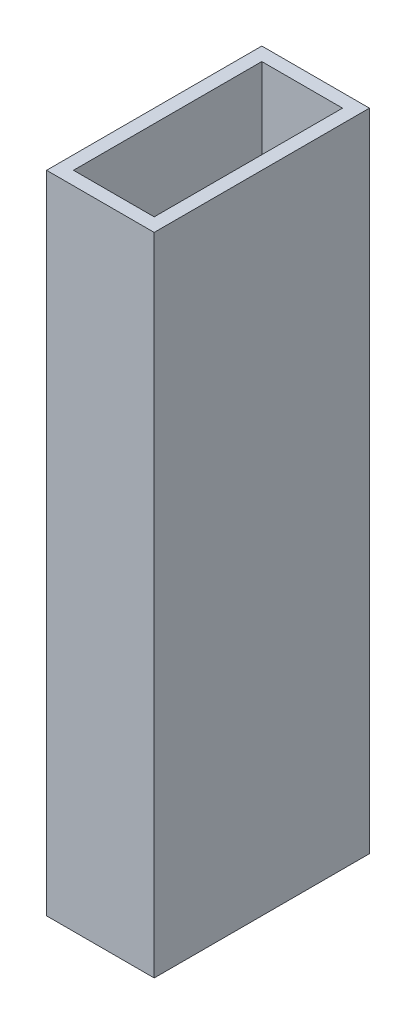
ISO-10303-21;
HEADER;
FILE_DESCRIPTION(('STEP AP214'),'2;1');
FILE_NAME('part.step','',(''),(''),'','','');
FILE_SCHEMA(('AUTOMOTIVE_DESIGN { 1 0 10303 214 1 1 1 1 }'));
ENDSEC;
DATA;
#1=APPLICATION_CONTEXT('core data for automotive mechanical design processes');
#2=APPLICATION_PROTOCOL_DEFINITION('international standard','automotive_design',2000,#1);
#3=PRODUCT_CONTEXT('',#1,'mechanical');
#4=PRODUCT('Part','Part','',(#3));
#5=PRODUCT_RELATED_PRODUCT_CATEGORY('part','',(#4));
#6=PRODUCT_DEFINITION_FORMATION('','',#4);
#7=PRODUCT_DEFINITION_CONTEXT('part definition',#1,'design');
#8=PRODUCT_DEFINITION('design','',#6,#7);
#9=PRODUCT_DEFINITION_SHAPE('','',#8);
#10=(LENGTH_UNIT() NAMED_UNIT(*) SI_UNIT(.MILLI.,.METRE.));
#11=(NAMED_UNIT(*) PLANE_ANGLE_UNIT() SI_UNIT($,.RADIAN.));
#12=(NAMED_UNIT(*) SI_UNIT($,.STERADIAN.) SOLID_ANGLE_UNIT());
#13=UNCERTAINTY_MEASURE_WITH_UNIT(LENGTH_MEASURE(1.E-05),#10,'distance_accuracy_value','');
#14=(GEOMETRIC_REPRESENTATION_CONTEXT(3) GLOBAL_UNCERTAINTY_ASSIGNED_CONTEXT((#13)) GLOBAL_UNIT_ASSIGNED_CONTEXT((#10,
#11,#12)) REPRESENTATION_CONTEXT('',''));
#15=CARTESIAN_POINT('',(0.,0.,0.));
#16=DIRECTION('',(0.,0.,1.));
#17=DIRECTION('',(1.,0.,0.));
#18=AXIS2_PLACEMENT_3D('',#15,#16,#17);
#19=CARTESIAN_POINT('',(0.,152.4,0.));
#20=DIRECTION('',(0.,-1.,0.));
#21=DIRECTION('',(0.,0.,-1.));
#22=AXIS2_PLACEMENT_3D('',#19,#20,#21);
#23=PLANE('',#22);
#24=DIRECTION('',(0.,0.,-1.));
#25=VECTOR('',#24,1.);
#26=CARTESIAN_POINT('',(12.7,152.4,25.4));
#27=LINE('',#26,#25);
#28=CARTESIAN_POINT('',(12.7,152.4,25.4));
#29=VERTEX_POINT('',#28);
#30=CARTESIAN_POINT('',(12.7,152.4,-25.4));
#31=VERTEX_POINT('',#30);
#32=EDGE_CURVE('E159',#29,#31,#27,.T.);
#33=ORIENTED_EDGE('',*,*,#32,.T.);
#34=DIRECTION('',(-1.,0.,0.));
#35=VECTOR('',#34,1.);
#36=CARTESIAN_POINT('',(-12.7,152.4,-25.4));
#37=LINE('',#36,#35);
#38=CARTESIAN_POINT('',(-12.7,152.4,-25.4));
#39=VERTEX_POINT('',#38);
#40=EDGE_CURVE('E163',#31,#39,#37,.T.);
#41=ORIENTED_EDGE('',*,*,#40,.T.);
#42=DIRECTION('',(0.,0.,1.));
#43=VECTOR('',#42,1.);
#44=CARTESIAN_POINT('',(-12.7,152.4,25.4));
#45=LINE('',#44,#43);
#46=CARTESIAN_POINT('',(-12.7,152.4,25.4));
#47=VERTEX_POINT('',#46);
#48=EDGE_CURVE('E167',#39,#47,#45,.T.);
#49=ORIENTED_EDGE('',*,*,#48,.T.);
#50=DIRECTION('',(1.,0.,0.));
#51=VECTOR('',#50,1.);
#52=CARTESIAN_POINT('',(-12.7,152.4,25.4));
#53=LINE('',#52,#51);
#54=EDGE_CURVE('E170',#47,#29,#53,.T.);
#55=ORIENTED_EDGE('',*,*,#54,.T.);
#56=EDGE_LOOP('',(#33,#41,#49,#55));
#57=FACE_BOUND('',#56,.T.);
#58=DIRECTION('',(1.,0.,0.));
#59=VECTOR('',#58,1.);
#60=CARTESIAN_POINT('',(-9.525,152.4,22.225));
#61=LINE('',#60,#59);
#62=CARTESIAN_POINT('',(-9.525,152.4,22.225));
#63=VERTEX_POINT('',#62);
#64=CARTESIAN_POINT('',(9.525,152.4,22.225));
#65=VERTEX_POINT('',#64);
#66=EDGE_CURVE('E111',#63,#65,#61,.T.);
#67=ORIENTED_EDGE('',*,*,#66,.F.);
#68=DIRECTION('',(0.,0.,1.));
#69=VECTOR('',#68,1.);
#70=CARTESIAN_POINT('',(-9.525,152.4,22.225));
#71=LINE('',#70,#69);
#72=CARTESIAN_POINT('',(-9.525,152.4,-22.225));
#73=VERTEX_POINT('',#72);
#74=EDGE_CURVE('E137',#73,#63,#71,.T.);
#75=ORIENTED_EDGE('',*,*,#74,.F.);
#76=DIRECTION('',(-1.,0.,0.));
#77=VECTOR('',#76,1.);
#78=CARTESIAN_POINT('',(-9.525,152.4,-22.225));
#79=LINE('',#78,#77);
#80=CARTESIAN_POINT('',(9.525,152.4,-22.225));
#81=VERTEX_POINT('',#80);
#82=EDGE_CURVE('E133',#81,#73,#79,.T.);
#83=ORIENTED_EDGE('',*,*,#82,.F.);
#84=DIRECTION('',(0.,0.,-1.));
#85=VECTOR('',#84,1.);
#86=CARTESIAN_POINT('',(9.525,152.4,22.225));
#87=LINE('',#86,#85);
#88=EDGE_CURVE('E120',#65,#81,#87,.T.);
#89=ORIENTED_EDGE('',*,*,#88,.F.);
#90=EDGE_LOOP('',(#67,#75,#83,#89));
#91=FACE_BOUND('',#90,.T.);
#92=ADVANCED_FACE('F45',(#57,#91),#23,.F.);
#93=CARTESIAN_POINT('',(0.,0.,0.));
#94=DIRECTION('',(0.,-1.,0.));
#95=DIRECTION('',(0.,0.,-1.));
#96=AXIS2_PLACEMENT_3D('',#93,#94,#95);
#97=PLANE('',#96);
#98=DIRECTION('',(0.,0.,-1.));
#99=VECTOR('',#98,1.);
#100=CARTESIAN_POINT('',(12.7,0.,25.4));
#101=LINE('',#100,#99);
#102=CARTESIAN_POINT('',(12.7,0.,25.4));
#103=VERTEX_POINT('',#102);
#104=CARTESIAN_POINT('',(12.7,0.,-25.4));
#105=VERTEX_POINT('',#104);
#106=EDGE_CURVE('E129',#103,#105,#101,.T.);
#107=ORIENTED_EDGE('',*,*,#106,.F.);
#108=DIRECTION('',(1.,0.,0.));
#109=VECTOR('',#108,1.);
#110=CARTESIAN_POINT('',(-12.7,0.,25.4));
#111=LINE('',#110,#109);
#112=CARTESIAN_POINT('',(-12.7,0.,25.4));
#113=VERTEX_POINT('',#112);
#114=EDGE_CURVE('E164',#113,#103,#111,.T.);
#115=ORIENTED_EDGE('',*,*,#114,.F.);
#116=DIRECTION('',(0.,0.,1.));
#117=VECTOR('',#116,1.);
#118=CARTESIAN_POINT('',(-12.7,0.,25.4));
#119=LINE('',#118,#117);
#120=CARTESIAN_POINT('',(-12.7,0.,-25.4));
#121=VERTEX_POINT('',#120);
#122=EDGE_CURVE('E180',#121,#113,#119,.T.);
#123=ORIENTED_EDGE('',*,*,#122,.F.);
#124=DIRECTION('',(-1.,0.,0.));
#125=VECTOR('',#124,1.);
#126=CARTESIAN_POINT('',(-12.7,0.,-25.4));
#127=LINE('',#126,#125);
#128=EDGE_CURVE('E177',#105,#121,#127,.T.);
#129=ORIENTED_EDGE('',*,*,#128,.F.);
#130=EDGE_LOOP('',(#107,#115,#123,#129));
#131=FACE_BOUND('',#130,.T.);
#132=DIRECTION('',(0.,0.,1.));
#133=VECTOR('',#132,1.);
#134=CARTESIAN_POINT('',(-9.525,0.,22.225));
#135=LINE('',#134,#133);
#136=CARTESIAN_POINT('',(-9.525,0.,-22.225));
#137=VERTEX_POINT('',#136);
#138=CARTESIAN_POINT('',(-9.525,0.,22.225));
#139=VERTEX_POINT('',#138);
#140=EDGE_CURVE('E121',#137,#139,#135,.T.);
#141=ORIENTED_EDGE('',*,*,#140,.T.);
#142=DIRECTION('',(1.,0.,0.));
#143=VECTOR('',#142,1.);
#144=CARTESIAN_POINT('',(-9.525,0.,22.225));
#145=LINE('',#144,#143);
#146=CARTESIAN_POINT('',(9.525,0.,22.225));
#147=VERTEX_POINT('',#146);
#148=EDGE_CURVE('E69',#139,#147,#145,.T.);
#149=ORIENTED_EDGE('',*,*,#148,.T.);
#150=DIRECTION('',(0.,0.,-1.));
#151=VECTOR('',#150,1.);
#152=CARTESIAN_POINT('',(9.525,0.,22.225));
#153=LINE('',#152,#151);
#154=CARTESIAN_POINT('',(9.525,0.,-22.225));
#155=VERTEX_POINT('',#154);
#156=EDGE_CURVE('E127',#147,#155,#153,.T.);
#157=ORIENTED_EDGE('',*,*,#156,.T.);
#158=DIRECTION('',(-1.,0.,0.));
#159=VECTOR('',#158,1.);
#160=CARTESIAN_POINT('',(-9.525,0.,-22.225));
#161=LINE('',#160,#159);
#162=EDGE_CURVE('E146',#155,#137,#161,.T.);
#163=ORIENTED_EDGE('',*,*,#162,.T.);
#164=EDGE_LOOP('',(#141,#149,#157,#163));
#165=FACE_BOUND('',#164,.T.);
#166=ADVANCED_FACE('F203',(#131,#165),#97,.T.);
#167=CARTESIAN_POINT('',(12.7,152.4,25.4));
#168=DIRECTION('',(-1.,0.,0.));
#169=DIRECTION('',(0.,0.,1.));
#170=AXIS2_PLACEMENT_3D('',#167,#168,#169);
#171=PLANE('',#170);
#172=ORIENTED_EDGE('',*,*,#106,.T.);
#173=DIRECTION('',(0.,-1.,0.));
#174=VECTOR('',#173,1.);
#175=CARTESIAN_POINT('',(12.7,152.4,-25.4));
#176=LINE('',#175,#174);
#177=EDGE_CURVE('E11',#31,#105,#176,.T.);
#178=ORIENTED_EDGE('',*,*,#177,.F.);
#179=ORIENTED_EDGE('',*,*,#32,.F.);
#180=DIRECTION('',(0.,-1.,0.));
#181=VECTOR('',#180,1.);
#182=CARTESIAN_POINT('',(12.7,152.4,25.4));
#183=LINE('',#182,#181);
#184=EDGE_CURVE('E173',#29,#103,#183,.T.);
#185=ORIENTED_EDGE('',*,*,#184,.T.);
#186=EDGE_LOOP('',(#172,#178,#179,#185));
#187=FACE_BOUND('',#186,.T.);
#188=ADVANCED_FACE('F47',(#187),#171,.F.);
#189=CARTESIAN_POINT('',(-12.7,152.4,-25.4));
#190=DIRECTION('',(0.,0.,1.));
#191=DIRECTION('',(1.,0.,0.));
#192=AXIS2_PLACEMENT_3D('',#189,#190,#191);
#193=PLANE('',#192);
#194=ORIENTED_EDGE('',*,*,#128,.T.);
#195=DIRECTION('',(0.,-1.,0.));
#196=VECTOR('',#195,1.);
#197=CARTESIAN_POINT('',(-12.7,152.4,-25.4));
#198=LINE('',#197,#196);
#199=EDGE_CURVE('E54',#39,#121,#198,.T.);
#200=ORIENTED_EDGE('',*,*,#199,.F.);
#201=ORIENTED_EDGE('',*,*,#40,.F.);
#202=ORIENTED_EDGE('',*,*,#177,.T.);
#203=EDGE_LOOP('',(#194,#200,#201,#202));
#204=FACE_BOUND('',#203,.T.);
#205=ADVANCED_FACE('F213',(#204),#193,.F.);
#206=CARTESIAN_POINT('',(-12.7,152.4,25.4));
#207=DIRECTION('',(1.,0.,0.));
#208=DIRECTION('',(0.,0.,-1.));
#209=AXIS2_PLACEMENT_3D('',#206,#207,#208);
#210=PLANE('',#209);
#211=ORIENTED_EDGE('',*,*,#122,.T.);
#212=DIRECTION('',(0.,-1.,0.));
#213=VECTOR('',#212,1.);
#214=CARTESIAN_POINT('',(-12.7,152.4,25.4));
#215=LINE('',#214,#213);
#216=EDGE_CURVE('E188',#47,#113,#215,.T.);
#217=ORIENTED_EDGE('',*,*,#216,.F.);
#218=ORIENTED_EDGE('',*,*,#48,.F.);
#219=ORIENTED_EDGE('',*,*,#199,.T.);
#220=EDGE_LOOP('',(#211,#217,#218,#219));
#221=FACE_BOUND('',#220,.T.);
#222=ADVANCED_FACE('F197',(#221),#210,.F.);
#223=CARTESIAN_POINT('',(-12.7,152.4,25.4));
#224=DIRECTION('',(0.,0.,-1.));
#225=DIRECTION('',(-1.,0.,0.));
#226=AXIS2_PLACEMENT_3D('',#223,#224,#225);
#227=PLANE('',#226);
#228=ORIENTED_EDGE('',*,*,#114,.T.);
#229=ORIENTED_EDGE('',*,*,#184,.F.);
#230=ORIENTED_EDGE('',*,*,#54,.F.);
#231=ORIENTED_EDGE('',*,*,#216,.T.);
#232=EDGE_LOOP('',(#228,#229,#230,#231));
#233=FACE_BOUND('',#232,.T.);
#234=ADVANCED_FACE('F207',(#233),#227,.F.);
#235=CARTESIAN_POINT('',(-9.525,152.4,22.225));
#236=DIRECTION('',(0.,0.,-1.));
#237=DIRECTION('',(-1.,0.,0.));
#238=AXIS2_PLACEMENT_3D('',#235,#236,#237);
#239=PLANE('',#238);
#240=ORIENTED_EDGE('',*,*,#148,.F.);
#241=DIRECTION('',(0.,-1.,0.));
#242=VECTOR('',#241,1.);
#243=CARTESIAN_POINT('',(-9.525,152.4,22.225));
#244=LINE('',#243,#242);
#245=EDGE_CURVE('E115',#63,#139,#244,.T.);
#246=ORIENTED_EDGE('',*,*,#245,.F.);
#247=ORIENTED_EDGE('',*,*,#66,.T.);
#248=DIRECTION('',(0.,-1.,0.));
#249=VECTOR('',#248,1.);
#250=CARTESIAN_POINT('',(9.525,152.4,22.225));
#251=LINE('',#250,#249);
#252=EDGE_CURVE('E114',#65,#147,#251,.T.);
#253=ORIENTED_EDGE('',*,*,#252,.T.);
#254=EDGE_LOOP('',(#240,#246,#247,#253));
#255=FACE_BOUND('',#254,.T.);
#256=ADVANCED_FACE('F113',(#255),#239,.T.);
#257=CARTESIAN_POINT('',(9.525,152.4,22.225));
#258=DIRECTION('',(-1.,0.,0.));
#259=DIRECTION('',(0.,0.,1.));
#260=AXIS2_PLACEMENT_3D('',#257,#258,#259);
#261=PLANE('',#260);
#262=ORIENTED_EDGE('',*,*,#156,.F.);
#263=ORIENTED_EDGE('',*,*,#252,.F.);
#264=ORIENTED_EDGE('',*,*,#88,.T.);
#265=DIRECTION('',(0.,-1.,0.));
#266=VECTOR('',#265,1.);
#267=CARTESIAN_POINT('',(9.525,152.4,-22.225));
#268=LINE('',#267,#266);
#269=EDGE_CURVE('E130',#81,#155,#268,.T.);
#270=ORIENTED_EDGE('',*,*,#269,.T.);
#271=EDGE_LOOP('',(#262,#263,#264,#270));
#272=FACE_BOUND('',#271,.T.);
#273=ADVANCED_FACE('F124',(#272),#261,.T.);
#274=CARTESIAN_POINT('',(-9.525,152.4,-22.225));
#275=DIRECTION('',(0.,0.,1.));
#276=DIRECTION('',(1.,0.,0.));
#277=AXIS2_PLACEMENT_3D('',#274,#275,#276);
#278=PLANE('',#277);
#279=ORIENTED_EDGE('',*,*,#162,.F.);
#280=ORIENTED_EDGE('',*,*,#269,.F.);
#281=ORIENTED_EDGE('',*,*,#82,.T.);
#282=DIRECTION('',(0.,-1.,0.));
#283=VECTOR('',#282,1.);
#284=CARTESIAN_POINT('',(-9.525,152.4,-22.225));
#285=LINE('',#284,#283);
#286=EDGE_CURVE('E61',#73,#137,#285,.T.);
#287=ORIENTED_EDGE('',*,*,#286,.T.);
#288=EDGE_LOOP('',(#279,#280,#281,#287));
#289=FACE_BOUND('',#288,.T.);
#290=ADVANCED_FACE('F236',(#289),#278,.T.);
#291=CARTESIAN_POINT('',(-9.525,152.4,22.225));
#292=DIRECTION('',(1.,0.,0.));
#293=DIRECTION('',(0.,0.,-1.));
#294=AXIS2_PLACEMENT_3D('',#291,#292,#293);
#295=PLANE('',#294);
#296=ORIENTED_EDGE('',*,*,#140,.F.);
#297=ORIENTED_EDGE('',*,*,#286,.F.);
#298=ORIENTED_EDGE('',*,*,#74,.T.);
#299=ORIENTED_EDGE('',*,*,#245,.T.);
#300=EDGE_LOOP('',(#296,#297,#298,#299));
#301=FACE_BOUND('',#300,.T.);
#302=ADVANCED_FACE('F240',(#301),#295,.T.);
#303=CLOSED_SHELL('',(#92,#166,#188,#205,#222,#234,#256,#273,#290,#302));
#304=MANIFOLD_SOLID_BREP('B2',#303);
#305=ADVANCED_BREP_SHAPE_REPRESENTATION('',(#18,#304),#14);
#306=SHAPE_DEFINITION_REPRESENTATION(#9,#305);
ENDSEC;
END-ISO-10303-21;
